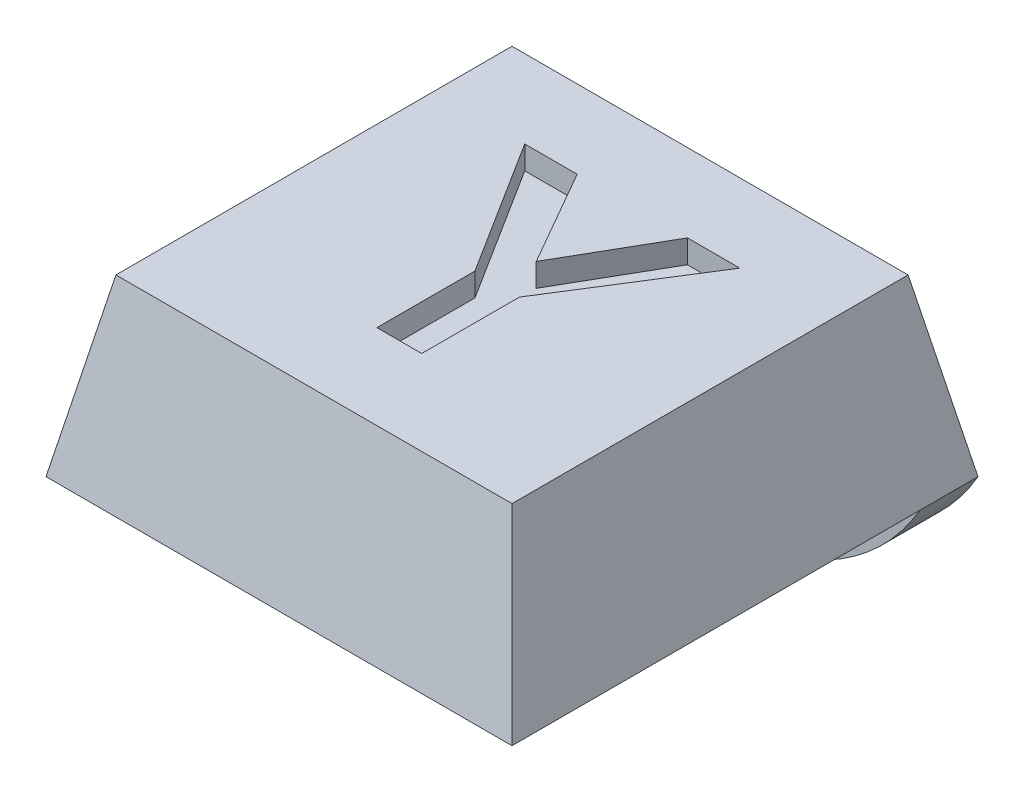
ISO-10303-21;
HEADER;
FILE_DESCRIPTION(('STEP AP214'),'2;1');
FILE_NAME('part.step','',(''),(''),'','','');
FILE_SCHEMA(('AUTOMOTIVE_DESIGN { 1 0 10303 214 1 1 1 1 }'));
ENDSEC;
DATA;
#1=APPLICATION_CONTEXT('core data for automotive mechanical design processes');
#2=APPLICATION_PROTOCOL_DEFINITION('international standard','automotive_design',2000,#1);
#3=PRODUCT_CONTEXT('',#1,'mechanical');
#4=PRODUCT('Part','Part','',(#3));
#5=PRODUCT_RELATED_PRODUCT_CATEGORY('part','',(#4));
#6=PRODUCT_DEFINITION_FORMATION('','',#4);
#7=PRODUCT_DEFINITION_CONTEXT('part definition',#1,'design');
#8=PRODUCT_DEFINITION('design','',#6,#7);
#9=PRODUCT_DEFINITION_SHAPE('','',#8);
#10=(LENGTH_UNIT() NAMED_UNIT(*) SI_UNIT(.MILLI.,.METRE.));
#11=(NAMED_UNIT(*) PLANE_ANGLE_UNIT() SI_UNIT($,.RADIAN.));
#12=(NAMED_UNIT(*) SI_UNIT($,.STERADIAN.) SOLID_ANGLE_UNIT());
#13=UNCERTAINTY_MEASURE_WITH_UNIT(LENGTH_MEASURE(1.E-05),#10,'distance_accuracy_value','');
#14=(GEOMETRIC_REPRESENTATION_CONTEXT(3) GLOBAL_UNCERTAINTY_ASSIGNED_CONTEXT((#13)) GLOBAL_UNIT_ASSIGNED_CONTEXT((#10,
#11,#12)) REPRESENTATION_CONTEXT('',''));
#15=CARTESIAN_POINT('',(0.,0.,0.));
#16=DIRECTION('',(0.,0.,1.));
#17=DIRECTION('',(1.,0.,0.));
#18=AXIS2_PLACEMENT_3D('',#15,#16,#17);
#19=CARTESIAN_POINT('',(0.,3.,0.));
#20=DIRECTION('',(0.,-1.,0.));
#21=DIRECTION('',(0.,0.,-1.));
#22=AXIS2_PLACEMENT_3D('',#19,#20,#21);
#23=PLANE('',#22);
#24=DIRECTION('',(-1.,0.,0.));
#25=VECTOR('',#24,1.);
#26=CARTESIAN_POINT('',(11.,3.,-0.6));
#27=LINE('',#26,#25);
#28=CARTESIAN_POINT('',(7.4,3.,-0.6));
#29=VERTEX_POINT('',#28);
#30=CARTESIAN_POINT('',(0.6,3.,-0.6));
#31=VERTEX_POINT('',#30);
#32=EDGE_CURVE('E211',#29,#31,#27,.T.);
#33=ORIENTED_EDGE('',*,*,#32,.F.);
#34=DIRECTION('',(0.,0.,1.));
#35=VECTOR('',#34,1.);
#36=CARTESIAN_POINT('',(7.4,3.,-8.));
#37=LINE('',#36,#35);
#38=CARTESIAN_POINT('',(7.4,3.,-7.4));
#39=VERTEX_POINT('',#38);
#40=EDGE_CURVE('E224',#39,#29,#37,.T.);
#41=ORIENTED_EDGE('',*,*,#40,.F.);
#42=DIRECTION('',(-1.,0.,0.));
#43=VECTOR('',#42,1.);
#44=CARTESIAN_POINT('',(11.,3.,-7.4));
#45=LINE('',#44,#43);
#46=CARTESIAN_POINT('',(0.599999999999999,3.,-7.4));
#47=VERTEX_POINT('',#46);
#48=EDGE_CURVE('E207',#39,#47,#45,.T.);
#49=ORIENTED_EDGE('',*,*,#48,.T.);
#50=DIRECTION('',(0.,0.,1.));
#51=VECTOR('',#50,1.);
#52=CARTESIAN_POINT('',(0.6,3.,-8.));
#53=LINE('',#52,#51);
#54=EDGE_CURVE('E227',#47,#31,#53,.T.);
#55=ORIENTED_EDGE('',*,*,#54,.T.);
#56=EDGE_LOOP('',(#33,#41,#49,#55));
#57=FACE_BOUND('',#56,.T.);
#58=DIRECTION('',(-1.,0.,0.));
#59=VECTOR('',#58,1.);
#60=CARTESIAN_POINT('',(4.39307301252336,3.,-2.05683246367483));
#61=LINE('',#60,#59);
#62=CARTESIAN_POINT('',(4.39307301252336,3.,-2.05683246367483));
#63=VERTEX_POINT('',#62);
#64=CARTESIAN_POINT('',(3.62384224329259,3.,-2.05683246367483));
#65=VERTEX_POINT('',#64);
#66=EDGE_CURVE('E58',#63,#65,#61,.T.);
#67=ORIENTED_EDGE('',*,*,#66,.T.);
#68=DIRECTION('',(0.,0.,-1.));
#69=VECTOR('',#68,1.);
#70=CARTESIAN_POINT('',(3.62384224329259,3.,-2.05683246367483));
#71=LINE('',#70,#69);
#72=CARTESIAN_POINT('',(3.62384224329259,3.,-3.74032605341842));
#73=VERTEX_POINT('',#72);
#74=EDGE_CURVE('E179',#65,#73,#71,.T.);
#75=ORIENTED_EDGE('',*,*,#74,.T.);
#76=DIRECTION('',(-0.533596697576265,0.,-0.845739063976416));
#77=VECTOR('',#76,1.);
#78=CARTESIAN_POINT('',(3.62384224329259,3.,-3.74032605341842));
#79=LINE('',#78,#77);
#80=CARTESIAN_POINT('',(2.16230378175413,3.,-6.05683246367483));
#81=VERTEX_POINT('',#80);
#82=EDGE_CURVE('E603',#73,#81,#79,.T.);
#83=ORIENTED_EDGE('',*,*,#82,.T.);
#84=DIRECTION('',(1.,0.,0.));
#85=VECTOR('',#84,1.);
#86=CARTESIAN_POINT('',(2.16230378175413,3.,-6.05683246367483));
#87=LINE('',#86,#85);
#88=CARTESIAN_POINT('',(3.06214352534388,3.,-6.05683246367483));
#89=VERTEX_POINT('',#88);
#90=EDGE_CURVE('E605',#81,#89,#87,.T.);
#91=ORIENTED_EDGE('',*,*,#90,.T.);
#92=DIRECTION('',(0.497591443991854,0.,0.867411525670545));
#93=VECTOR('',#92,1.);
#94=CARTESIAN_POINT('',(3.06214352534388,3.,-6.05683246367483));
#95=LINE('',#94,#93);
#96=CARTESIAN_POINT('',(4.0076563458567,3.,-4.40859528418765));
#97=VERTEX_POINT('',#96);
#98=EDGE_CURVE('E610',#89,#97,#95,.T.);
#99=ORIENTED_EDGE('',*,*,#98,.T.);
#100=DIRECTION('',(0.498225602522097,0.,-0.867047431800299));
#101=VECTOR('',#100,1.);
#102=CARTESIAN_POINT('',(4.0076563458567,3.,-4.40859528418765));
#103=LINE('',#102,#101);
#104=CARTESIAN_POINT('',(4.95477173047208,3.,-6.05683246367483));
#105=VERTEX_POINT('',#104);
#106=EDGE_CURVE('E578',#97,#105,#103,.T.);
#107=ORIENTED_EDGE('',*,*,#106,.T.);
#108=DIRECTION('',(1.,0.,0.));
#109=VECTOR('',#108,1.);
#110=CARTESIAN_POINT('',(4.95477173047208,3.,-6.05683246367483));
#111=LINE('',#110,#109);
#112=CARTESIAN_POINT('',(5.85461147406183,3.,-6.05683246367483));
#113=VERTEX_POINT('',#112);
#114=EDGE_CURVE('E573',#105,#113,#111,.T.);
#115=ORIENTED_EDGE('',*,*,#114,.T.);
#116=DIRECTION('',(-0.532673842471013,0.,0.846320611557563));
#117=VECTOR('',#116,1.);
#118=CARTESIAN_POINT('',(5.85461147406183,3.,-6.05683246367483));
#119=LINE('',#118,#117);
#120=CARTESIAN_POINT('',(4.39307301252336,3.,-3.73471707905944));
#121=VERTEX_POINT('',#120);
#122=EDGE_CURVE('E567',#113,#121,#119,.T.);
#123=ORIENTED_EDGE('',*,*,#122,.T.);
#124=DIRECTION('',(0.,0.,1.));
#125=VECTOR('',#124,1.);
#126=CARTESIAN_POINT('',(4.39307301252336,3.,-3.73471707905944));
#127=LINE('',#126,#125);
#128=EDGE_CURVE('E175',#121,#63,#127,.T.);
#129=ORIENTED_EDGE('',*,*,#128,.T.);
#130=EDGE_LOOP('',(#67,#75,#83,#91,#99,#107,#115,#123,#129));
#131=FACE_BOUND('',#130,.T.);
#132=ADVANCED_FACE('F42',(#57,#131),#23,.F.);
#133=CARTESIAN_POINT('',(8.,0.,-8.));
#134=DIRECTION('',(-0.98058067569092,-0.196116135138184,0.));
#135=DIRECTION('',(0.196116135138184,-0.98058067569092,0.));
#136=AXIS2_PLACEMENT_3D('',#133,#134,#135);
#137=PLANE('',#136);
#138=DIRECTION('',(-0.192450089729875,0.962250448649376,-0.192450089729875));
#139=VECTOR('',#138,1.);
#140=CARTESIAN_POINT('',(7.7037037037037,1.48148148148148,-0.296296296296296));
#141=LINE('',#140,#139);
#142=CARTESIAN_POINT('',(8.,0.,0.));
#143=VERTEX_POINT('',#142);
#144=EDGE_CURVE('E221',#143,#29,#141,.T.);
#145=ORIENTED_EDGE('',*,*,#144,.F.);
#146=DIRECTION('',(0.,0.,-1.));
#147=VECTOR('',#146,1.);
#148=CARTESIAN_POINT('',(8.,0.,0.));
#149=LINE('',#148,#147);
#150=CARTESIAN_POINT('',(8.,0.,-7.));
#151=VERTEX_POINT('',#150);
#152=EDGE_CURVE('E240',#143,#151,#149,.T.);
#153=ORIENTED_EDGE('',*,*,#152,.T.);
#154=DIRECTION('',(0.,0.,1.));
#155=VECTOR('',#154,1.);
#156=CARTESIAN_POINT('',(8.,0.,-8.));
#157=LINE('',#156,#155);
#158=CARTESIAN_POINT('',(8.,0.,-8.));
#159=VERTEX_POINT('',#158);
#160=EDGE_CURVE('E181',#159,#151,#157,.T.);
#161=ORIENTED_EDGE('',*,*,#160,.F.);
#162=DIRECTION('',(0.192450089729875,-0.962250448649376,-0.192450089729875));
#163=VECTOR('',#162,1.);
#164=CARTESIAN_POINT('',(8.,0.,-8.));
#165=LINE('',#164,#163);
#166=EDGE_CURVE('E214',#39,#159,#165,.T.);
#167=ORIENTED_EDGE('',*,*,#166,.F.);
#168=ORIENTED_EDGE('',*,*,#40,.T.);
#169=EDGE_LOOP('',(#145,#153,#161,#167,#168));
#170=FACE_BOUND('',#169,.T.);
#171=ADVANCED_FACE('F308',(#170),#137,.F.);
#172=CARTESIAN_POINT('',(0.,0.,-8.));
#173=DIRECTION('',(0.98058067569092,-0.196116135138184,0.));
#174=DIRECTION('',(0.196116135138184,0.98058067569092,0.));
#175=AXIS2_PLACEMENT_3D('',#172,#173,#174);
#176=PLANE('',#175);
#177=DIRECTION('',(-0.192450089729875,-0.962250448649376,0.192450089729875));
#178=VECTOR('',#177,1.);
#179=CARTESIAN_POINT('',(0.296296296296296,1.48148148148148,-0.296296296296296));
#180=LINE('',#179,#178);
#181=CARTESIAN_POINT('',(0.,0.,0.));
#182=VERTEX_POINT('',#181);
#183=EDGE_CURVE('E268',#31,#182,#180,.T.);
#184=ORIENTED_EDGE('',*,*,#183,.F.);
#185=ORIENTED_EDGE('',*,*,#54,.F.);
#186=DIRECTION('',(0.192450089729875,0.962250448649376,0.192450089729875));
#187=VECTOR('',#186,1.);
#188=CARTESIAN_POINT('',(0.,0.,-8.));
#189=LINE('',#188,#187);
#190=CARTESIAN_POINT('',(0.,0.,-8.));
#191=VERTEX_POINT('',#190);
#192=EDGE_CURVE('E239',#191,#47,#189,.T.);
#193=ORIENTED_EDGE('',*,*,#192,.F.);
#194=DIRECTION('',(0.,0.,1.));
#195=VECTOR('',#194,1.);
#196=CARTESIAN_POINT('',(0.,0.,0.));
#197=LINE('',#196,#195);
#198=CARTESIAN_POINT('',(0.,0.,-7.));
#199=VERTEX_POINT('',#198);
#200=EDGE_CURVE('E244',#191,#199,#197,.T.);
#201=ORIENTED_EDGE('',*,*,#200,.T.);
#202=EDGE_CURVE('E231',#199,#182,#197,.T.);
#203=ORIENTED_EDGE('',*,*,#202,.T.);
#204=EDGE_LOOP('',(#184,#185,#193,#201,#203));
#205=FACE_BOUND('',#204,.T.);
#206=ADVANCED_FACE('F292',(#205),#176,.F.);
#207=CARTESIAN_POINT('',(0.,0.,0.));
#208=DIRECTION('',(0.,-1.,0.));
#209=DIRECTION('',(0.,0.,-1.));
#210=AXIS2_PLACEMENT_3D('',#207,#208,#209);
#211=PLANE('',#210);
#212=DIRECTION('',(-1.,0.,0.));
#213=VECTOR('',#212,1.);
#214=CARTESIAN_POINT('',(0.,0.,-7.));
#215=LINE('',#214,#213);
#216=EDGE_CURVE('E187',#151,#199,#215,.T.);
#217=ORIENTED_EDGE('',*,*,#216,.F.);
#218=ORIENTED_EDGE('',*,*,#152,.F.);
#219=DIRECTION('',(1.,0.,0.));
#220=VECTOR('',#219,1.);
#221=CARTESIAN_POINT('',(0.,0.,0.));
#222=LINE('',#221,#220);
#223=EDGE_CURVE('E241',#182,#143,#222,.T.);
#224=ORIENTED_EDGE('',*,*,#223,.F.);
#225=ORIENTED_EDGE('',*,*,#202,.F.);
#226=EDGE_LOOP('',(#217,#218,#224,#225));
#227=FACE_BOUND('',#226,.T.);
#228=CARTESIAN_POINT('',(4.,0.,-3.75));
#229=DIRECTION('',(0.,-1.,0.));
#230=DIRECTION('',(0.,0.,-1.));
#231=AXIS2_PLACEMENT_3D('',#228,#229,#230);
#232=CIRCLE('',#231,1.8);
#233=CARTESIAN_POINT('',(4.,0.,-5.55));
#234=VERTEX_POINT('',#233);
#235=EDGE_CURVE('E199',#234,#234,#232,.T.);
#236=ORIENTED_EDGE('',*,*,#235,.F.);
#237=EDGE_LOOP('',(#236));
#238=FACE_BOUND('',#237,.T.);
#239=ADVANCED_FACE('F303',(#227,#238),#211,.T.);
#240=CARTESIAN_POINT('',(11.,3.,-7.4));
#241=DIRECTION('',(0.,0.196116135138184,-0.98058067569092));
#242=DIRECTION('',(0.,0.98058067569092,0.196116135138184));
#243=AXIS2_PLACEMENT_3D('',#240,#241,#242);
#244=PLANE('',#243);
#245=ORIENTED_EDGE('',*,*,#166,.T.);
#246=DIRECTION('',(-1.,0.,0.));
#247=VECTOR('',#246,1.);
#248=CARTESIAN_POINT('',(0.,0.,-8.));
#249=LINE('',#248,#247);
#250=EDGE_CURVE('E235',#159,#191,#249,.T.);
#251=ORIENTED_EDGE('',*,*,#250,.T.);
#252=ORIENTED_EDGE('',*,*,#192,.T.);
#253=ORIENTED_EDGE('',*,*,#48,.F.);
#254=EDGE_LOOP('',(#245,#251,#252,#253));
#255=FACE_BOUND('',#254,.T.);
#256=ADVANCED_FACE('F287',(#255),#244,.T.);
#257=CARTESIAN_POINT('',(11.,0.,0.));
#258=DIRECTION('',(0.,0.196116135138184,0.98058067569092));
#259=DIRECTION('',(0.,-0.98058067569092,0.196116135138184));
#260=AXIS2_PLACEMENT_3D('',#257,#258,#259);
#261=PLANE('',#260);
#262=ORIENTED_EDGE('',*,*,#144,.T.);
#263=ORIENTED_EDGE('',*,*,#32,.T.);
#264=ORIENTED_EDGE('',*,*,#183,.T.);
#265=ORIENTED_EDGE('',*,*,#223,.T.);
#266=EDGE_LOOP('',(#262,#263,#264,#265));
#267=FACE_BOUND('',#266,.T.);
#268=ADVANCED_FACE('F334',(#267),#261,.T.);
#269=CARTESIAN_POINT('',(4.,0.8,-3.75));
#270=DIRECTION('',(0.,-1.,0.));
#271=DIRECTION('',(0.,0.,-1.));
#272=AXIS2_PLACEMENT_3D('',#269,#270,#271);
#273=CYLINDRICAL_SURFACE('',#272,1.8);
#274=CARTESIAN_POINT('',(4.,0.8,-3.75));
#275=DIRECTION('',(0.,-1.,0.));
#276=DIRECTION('',(0.,0.,-1.));
#277=AXIS2_PLACEMENT_3D('',#274,#275,#276);
#278=CIRCLE('',#277,1.8);
#279=CARTESIAN_POINT('',(4.,0.8,-5.55));
#280=VERTEX_POINT('',#279);
#281=EDGE_CURVE('E203',#280,#280,#278,.T.);
#282=ORIENTED_EDGE('',*,*,#281,.F.);
#283=EDGE_LOOP('',(#282));
#284=FACE_BOUND('',#283,.T.);
#285=ORIENTED_EDGE('',*,*,#235,.T.);
#286=EDGE_LOOP('',(#285));
#287=FACE_BOUND('',#286,.T.);
#288=ADVANCED_FACE('F341',(#284,#287),#273,.F.);
#289=CARTESIAN_POINT('',(4.,0.8,-3.75));
#290=DIRECTION('',(0.,-1.,0.));
#291=DIRECTION('',(0.,0.,-1.));
#292=AXIS2_PLACEMENT_3D('',#289,#290,#291);
#293=PLANE('',#292);
#294=ORIENTED_EDGE('',*,*,#281,.T.);
#295=EDGE_LOOP('',(#294));
#296=FACE_BOUND('',#295,.T.);
#297=ADVANCED_FACE('F345',(#296),#293,.T.);
#298=CARTESIAN_POINT('',(0.,-2.,-8.));
#299=DIRECTION('',(0.,0.,1.));
#300=DIRECTION('',(1.,0.,0.));
#301=AXIS2_PLACEMENT_3D('',#298,#299,#300);
#302=PLANE('',#301);
#303=ORIENTED_EDGE('',*,*,#250,.F.);
#304=CARTESIAN_POINT('',(4.53589838486225,2.,-8.));
#305=DIRECTION('',(0.,0.,1.));
#306=DIRECTION('',(1.,0.,0.));
#307=AXIS2_PLACEMENT_3D('',#304,#305,#306);
#308=CIRCLE('',#307,4.);
#309=CARTESIAN_POINT('',(4.53589838486225,-2.,-8.));
#310=VERTEX_POINT('',#309);
#311=EDGE_CURVE('E11',#159,#310,#308,.F.);
#312=ORIENTED_EDGE('',*,*,#311,.T.);
#313=DIRECTION('',(1.,0.,0.));
#314=VECTOR('',#313,1.);
#315=CARTESIAN_POINT('',(0.,-2.,-8.));
#316=LINE('',#315,#314);
#317=CARTESIAN_POINT('',(3.46410161513775,-2.,-8.));
#318=VERTEX_POINT('',#317);
#319=EDGE_CURVE('E193',#318,#310,#316,.T.);
#320=ORIENTED_EDGE('',*,*,#319,.F.);
#321=CARTESIAN_POINT('',(3.46410161513775,2.,-8.));
#322=DIRECTION('',(0.,0.,1.));
#323=DIRECTION('',(1.,0.,0.));
#324=AXIS2_PLACEMENT_3D('',#321,#322,#323);
#325=CIRCLE('',#324,4.);
#326=EDGE_CURVE('E51',#318,#191,#325,.F.);
#327=ORIENTED_EDGE('',*,*,#326,.T.);
#328=EDGE_LOOP('',(#303,#312,#320,#327));
#329=FACE_BOUND('',#328,.T.);
#330=ADVANCED_FACE('F280',(#329),#302,.F.);
#331=CARTESIAN_POINT('',(0.,-2.,-7.));
#332=DIRECTION('',(0.,0.,-1.));
#333=DIRECTION('',(-1.,0.,0.));
#334=AXIS2_PLACEMENT_3D('',#331,#332,#333);
#335=PLANE('',#334);
#336=DIRECTION('',(-1.,0.,0.));
#337=VECTOR('',#336,1.);
#338=CARTESIAN_POINT('',(0.,-2.,-7.));
#339=LINE('',#338,#337);
#340=CARTESIAN_POINT('',(4.53589838486225,-2.,-7.));
#341=VERTEX_POINT('',#340);
#342=CARTESIAN_POINT('',(3.46410161513775,-2.,-7.));
#343=VERTEX_POINT('',#342);
#344=EDGE_CURVE('E197',#341,#343,#339,.T.);
#345=ORIENTED_EDGE('',*,*,#344,.F.);
#346=CARTESIAN_POINT('',(4.53589838486225,2.,-7.));
#347=DIRECTION('',(0.,0.,-1.));
#348=DIRECTION('',(-1.,0.,0.));
#349=AXIS2_PLACEMENT_3D('',#346,#347,#348);
#350=CIRCLE('',#349,4.);
#351=EDGE_CURVE('E274',#341,#151,#350,.F.);
#352=ORIENTED_EDGE('',*,*,#351,.T.);
#353=ORIENTED_EDGE('',*,*,#216,.T.);
#354=CARTESIAN_POINT('',(3.46410161513775,2.,-7.));
#355=DIRECTION('',(0.,0.,-1.));
#356=DIRECTION('',(-1.,0.,0.));
#357=AXIS2_PLACEMENT_3D('',#354,#355,#356);
#358=CIRCLE('',#357,4.);
#359=EDGE_CURVE('E66',#199,#343,#358,.F.);
#360=ORIENTED_EDGE('',*,*,#359,.T.);
#361=EDGE_LOOP('',(#345,#352,#353,#360));
#362=FACE_BOUND('',#361,.T.);
#363=ADVANCED_FACE('F298',(#362),#335,.F.);
#364=CARTESIAN_POINT('',(0.,-2.,0.));
#365=DIRECTION('',(0.,1.,0.));
#366=DIRECTION('',(0.,0.,1.));
#367=AXIS2_PLACEMENT_3D('',#364,#365,#366);
#368=PLANE('',#367);
#369=ORIENTED_EDGE('',*,*,#319,.T.);
#370=DIRECTION('',(0.,0.,1.));
#371=VECTOR('',#370,1.);
#372=CARTESIAN_POINT('',(4.53589838486225,-2.,0.));
#373=LINE('',#372,#371);
#374=EDGE_CURVE('E267',#310,#341,#373,.T.);
#375=ORIENTED_EDGE('',*,*,#374,.T.);
#376=ORIENTED_EDGE('',*,*,#344,.T.);
#377=DIRECTION('',(0.,0.,-1.));
#378=VECTOR('',#377,1.);
#379=CARTESIAN_POINT('',(3.46410161513775,-2.,0.));
#380=LINE('',#379,#378);
#381=EDGE_CURVE('E263',#343,#318,#380,.T.);
#382=ORIENTED_EDGE('',*,*,#381,.T.);
#383=EDGE_LOOP('',(#369,#375,#376,#382));
#384=FACE_BOUND('',#383,.T.);
#385=ADVANCED_FACE('F296',(#384),#368,.F.);
#386=CARTESIAN_POINT('',(4.53589838486225,2.,-8.));
#387=DIRECTION('',(0.,0.,1.));
#388=DIRECTION('',(1.,0.,0.));
#389=AXIS2_PLACEMENT_3D('',#386,#387,#388);
#390=CYLINDRICAL_SURFACE('',#389,4.);
#391=ORIENTED_EDGE('',*,*,#311,.F.);
#392=ORIENTED_EDGE('',*,*,#160,.T.);
#393=ORIENTED_EDGE('',*,*,#351,.F.);
#394=ORIENTED_EDGE('',*,*,#374,.F.);
#395=EDGE_LOOP('',(#391,#392,#393,#394));
#396=FACE_BOUND('',#395,.T.);
#397=ADVANCED_FACE('F309',(#396),#390,.T.);
#398=CARTESIAN_POINT('',(3.46410161513775,2.,-8.));
#399=DIRECTION('',(0.,0.,-1.));
#400=DIRECTION('',(-1.,0.,0.));
#401=AXIS2_PLACEMENT_3D('',#398,#399,#400);
#402=CYLINDRICAL_SURFACE('',#401,4.);
#403=ORIENTED_EDGE('',*,*,#359,.F.);
#404=ORIENTED_EDGE('',*,*,#200,.F.);
#405=ORIENTED_EDGE('',*,*,#326,.F.);
#406=ORIENTED_EDGE('',*,*,#381,.F.);
#407=EDGE_LOOP('',(#403,#404,#405,#406));
#408=FACE_BOUND('',#407,.T.);
#409=ADVANCED_FACE('F44',(#408),#402,.T.);
#410=CARTESIAN_POINT('',(4.39307301252336,2.6,-2.05683246367483));
#411=DIRECTION('',(0.,0.,-1.));
#412=DIRECTION('',(-1.,0.,0.));
#413=AXIS2_PLACEMENT_3D('',#410,#411,#412);
#414=PLANE('',#413);
#415=ORIENTED_EDGE('',*,*,#66,.F.);
#416=DIRECTION('',(0.,1.,0.));
#417=VECTOR('',#416,1.);
#418=CARTESIAN_POINT('',(4.39307301252336,2.6,-2.05683246367483));
#419=LINE('',#418,#417);
#420=CARTESIAN_POINT('',(4.39307301252336,2.6,-2.05683246367483));
#421=VERTEX_POINT('',#420);
#422=EDGE_CURVE('E173',#421,#63,#419,.T.);
#423=ORIENTED_EDGE('',*,*,#422,.F.);
#424=DIRECTION('',(-1.,0.,0.));
#425=VECTOR('',#424,1.);
#426=CARTESIAN_POINT('',(4.39307301252336,2.6,-2.05683246367483));
#427=LINE('',#426,#425);
#428=CARTESIAN_POINT('',(3.62384224329259,2.6,-2.05683246367483));
#429=VERTEX_POINT('',#428);
#430=EDGE_CURVE('E163',#421,#429,#427,.T.);
#431=ORIENTED_EDGE('',*,*,#430,.T.);
#432=DIRECTION('',(0.,1.,0.));
#433=VECTOR('',#432,1.);
#434=CARTESIAN_POINT('',(3.62384224329259,2.6,-2.05683246367483));
#435=LINE('',#434,#433);
#436=EDGE_CURVE('E172',#429,#65,#435,.T.);
#437=ORIENTED_EDGE('',*,*,#436,.T.);
#438=EDGE_LOOP('',(#415,#423,#431,#437));
#439=FACE_BOUND('',#438,.T.);
#440=ADVANCED_FACE('F171',(#439),#414,.T.);
#441=CARTESIAN_POINT('',(3.62384224329259,2.6,-2.05683246367483));
#442=DIRECTION('',(1.,0.,0.));
#443=DIRECTION('',(0.,0.,-1.));
#444=AXIS2_PLACEMENT_3D('',#441,#442,#443);
#445=PLANE('',#444);
#446=ORIENTED_EDGE('',*,*,#74,.F.);
#447=ORIENTED_EDGE('',*,*,#436,.F.);
#448=DIRECTION('',(0.,0.,-1.));
#449=VECTOR('',#448,1.);
#450=CARTESIAN_POINT('',(3.62384224329259,2.6,-2.05683246367483));
#451=LINE('',#450,#449);
#452=CARTESIAN_POINT('',(3.62384224329259,2.6,-3.74032605341842));
#453=VERTEX_POINT('',#452);
#454=EDGE_CURVE('E159',#429,#453,#451,.T.);
#455=ORIENTED_EDGE('',*,*,#454,.T.);
#456=DIRECTION('',(0.,1.,0.));
#457=VECTOR('',#456,1.);
#458=CARTESIAN_POINT('',(3.62384224329259,2.6,-3.74032605341842));
#459=LINE('',#458,#457);
#460=EDGE_CURVE('E182',#453,#73,#459,.T.);
#461=ORIENTED_EDGE('',*,*,#460,.T.);
#462=EDGE_LOOP('',(#446,#447,#455,#461));
#463=FACE_BOUND('',#462,.T.);
#464=ADVANCED_FACE('F177',(#463),#445,.T.);
#465=CARTESIAN_POINT('',(3.62384224329259,2.6,-3.74032605341842));
#466=DIRECTION('',(0.845739063976416,0.,-0.533596697576265));
#467=DIRECTION('',(-0.533596697576265,0.,-0.845739063976416));
#468=AXIS2_PLACEMENT_3D('',#465,#466,#467);
#469=PLANE('',#468);
#470=ORIENTED_EDGE('',*,*,#82,.F.);
#471=ORIENTED_EDGE('',*,*,#460,.F.);
#472=DIRECTION('',(-0.533596697576265,0.,-0.845739063976416));
#473=VECTOR('',#472,1.);
#474=CARTESIAN_POINT('',(3.62384224329259,2.6,-3.74032605341842));
#475=LINE('',#474,#473);
#476=CARTESIAN_POINT('',(2.16230378175413,2.6,-6.05683246367483));
#477=VERTEX_POINT('',#476);
#478=EDGE_CURVE('E165',#453,#477,#475,.T.);
#479=ORIENTED_EDGE('',*,*,#478,.T.);
#480=DIRECTION('',(0.,1.,0.));
#481=VECTOR('',#480,1.);
#482=CARTESIAN_POINT('',(2.16230378175413,2.6,-6.05683246367483));
#483=LINE('',#482,#481);
#484=EDGE_CURVE('E189',#477,#81,#483,.T.);
#485=ORIENTED_EDGE('',*,*,#484,.T.);
#486=EDGE_LOOP('',(#470,#471,#479,#485));
#487=FACE_BOUND('',#486,.T.);
#488=ADVANCED_FACE('F358',(#487),#469,.T.);
#489=CARTESIAN_POINT('',(2.16230378175413,2.6,-6.05683246367483));
#490=DIRECTION('',(0.,0.,1.));
#491=DIRECTION('',(1.,0.,0.));
#492=AXIS2_PLACEMENT_3D('',#489,#490,#491);
#493=PLANE('',#492);
#494=ORIENTED_EDGE('',*,*,#90,.F.);
#495=ORIENTED_EDGE('',*,*,#484,.F.);
#496=DIRECTION('',(1.,0.,0.));
#497=VECTOR('',#496,1.);
#498=CARTESIAN_POINT('',(2.16230378175413,2.6,-6.05683246367483));
#499=LINE('',#498,#497);
#500=CARTESIAN_POINT('',(3.06214352534388,2.6,-6.05683246367483));
#501=VERTEX_POINT('',#500);
#502=EDGE_CURVE('E642',#477,#501,#499,.T.);
#503=ORIENTED_EDGE('',*,*,#502,.T.);
#504=DIRECTION('',(0.,1.,0.));
#505=VECTOR('',#504,1.);
#506=CARTESIAN_POINT('',(3.06214352534388,2.6,-6.05683246367483));
#507=LINE('',#506,#505);
#508=EDGE_CURVE('E596',#501,#89,#507,.T.);
#509=ORIENTED_EDGE('',*,*,#508,.T.);
#510=EDGE_LOOP('',(#494,#495,#503,#509));
#511=FACE_BOUND('',#510,.T.);
#512=ADVANCED_FACE('F361',(#511),#493,.T.);
#513=CARTESIAN_POINT('',(3.06214352534388,2.6,-6.05683246367483));
#514=DIRECTION('',(-0.867411525670545,0.,0.497591443991854));
#515=DIRECTION('',(0.497591443991854,0.,0.867411525670545));
#516=AXIS2_PLACEMENT_3D('',#513,#514,#515);
#517=PLANE('',#516);
#518=ORIENTED_EDGE('',*,*,#98,.F.);
#519=ORIENTED_EDGE('',*,*,#508,.F.);
#520=DIRECTION('',(0.497591443991854,0.,0.867411525670545));
#521=VECTOR('',#520,1.);
#522=CARTESIAN_POINT('',(3.06214352534388,2.6,-6.05683246367483));
#523=LINE('',#522,#521);
#524=CARTESIAN_POINT('',(4.0076563458567,2.6,-4.40859528418765));
#525=VERTEX_POINT('',#524);
#526=EDGE_CURVE('E639',#501,#525,#523,.T.);
#527=ORIENTED_EDGE('',*,*,#526,.T.);
#528=DIRECTION('',(0.,1.,0.));
#529=VECTOR('',#528,1.);
#530=CARTESIAN_POINT('',(4.0076563458567,2.6,-4.40859528418765));
#531=LINE('',#530,#529);
#532=EDGE_CURVE('E593',#525,#97,#531,.T.);
#533=ORIENTED_EDGE('',*,*,#532,.T.);
#534=EDGE_LOOP('',(#518,#519,#527,#533));
#535=FACE_BOUND('',#534,.T.);
#536=ADVANCED_FACE('F365',(#535),#517,.T.);
#537=CARTESIAN_POINT('',(4.0076563458567,2.6,-4.40859528418765));
#538=DIRECTION('',(0.867047431800299,0.,0.498225602522097));
#539=DIRECTION('',(0.498225602522097,0.,-0.867047431800299));
#540=AXIS2_PLACEMENT_3D('',#537,#538,#539);
#541=PLANE('',#540);
#542=ORIENTED_EDGE('',*,*,#106,.F.);
#543=ORIENTED_EDGE('',*,*,#532,.F.);
#544=DIRECTION('',(0.498225602522097,0.,-0.867047431800299));
#545=VECTOR('',#544,1.);
#546=CARTESIAN_POINT('',(4.0076563458567,2.6,-4.40859528418765));
#547=LINE('',#546,#545);
#548=CARTESIAN_POINT('',(4.95477173047208,2.6,-6.05683246367483));
#549=VERTEX_POINT('',#548);
#550=EDGE_CURVE('E624',#525,#549,#547,.T.);
#551=ORIENTED_EDGE('',*,*,#550,.T.);
#552=DIRECTION('',(0.,1.,0.));
#553=VECTOR('',#552,1.);
#554=CARTESIAN_POINT('',(4.95477173047208,2.6,-6.05683246367483));
#555=LINE('',#554,#553);
#556=EDGE_CURVE('E590',#549,#105,#555,.T.);
#557=ORIENTED_EDGE('',*,*,#556,.T.);
#558=EDGE_LOOP('',(#542,#543,#551,#557));
#559=FACE_BOUND('',#558,.T.);
#560=ADVANCED_FACE('F369',(#559),#541,.T.);
#561=CARTESIAN_POINT('',(4.95477173047208,2.6,-6.05683246367483));
#562=DIRECTION('',(0.,0.,1.));
#563=DIRECTION('',(1.,0.,0.));
#564=AXIS2_PLACEMENT_3D('',#561,#562,#563);
#565=PLANE('',#564);
#566=ORIENTED_EDGE('',*,*,#114,.F.);
#567=ORIENTED_EDGE('',*,*,#556,.F.);
#568=DIRECTION('',(1.,0.,0.));
#569=VECTOR('',#568,1.);
#570=CARTESIAN_POINT('',(4.95477173047208,2.6,-6.05683246367483));
#571=LINE('',#570,#569);
#572=CARTESIAN_POINT('',(5.85461147406183,2.6,-6.05683246367483));
#573=VERTEX_POINT('',#572);
#574=EDGE_CURVE('E626',#549,#573,#571,.T.);
#575=ORIENTED_EDGE('',*,*,#574,.T.);
#576=DIRECTION('',(0.,1.,0.));
#577=VECTOR('',#576,1.);
#578=CARTESIAN_POINT('',(5.85461147406183,2.6,-6.05683246367483));
#579=LINE('',#578,#577);
#580=EDGE_CURVE('E587',#573,#113,#579,.T.);
#581=ORIENTED_EDGE('',*,*,#580,.T.);
#582=EDGE_LOOP('',(#566,#567,#575,#581));
#583=FACE_BOUND('',#582,.T.);
#584=ADVANCED_FACE('F373',(#583),#565,.T.);
#585=CARTESIAN_POINT('',(5.85461147406183,2.6,-6.05683246367483));
#586=DIRECTION('',(-0.846320611557563,0.,-0.532673842471013));
#587=DIRECTION('',(-0.532673842471013,0.,0.846320611557563));
#588=AXIS2_PLACEMENT_3D('',#585,#586,#587);
#589=PLANE('',#588);
#590=ORIENTED_EDGE('',*,*,#122,.F.);
#591=ORIENTED_EDGE('',*,*,#580,.F.);
#592=DIRECTION('',(-0.532673842471013,0.,0.846320611557563));
#593=VECTOR('',#592,1.);
#594=CARTESIAN_POINT('',(5.85461147406183,2.6,-6.05683246367483));
#595=LINE('',#594,#593);
#596=CARTESIAN_POINT('',(4.39307301252336,2.6,-3.73471707905944));
#597=VERTEX_POINT('',#596);
#598=EDGE_CURVE('E628',#573,#597,#595,.T.);
#599=ORIENTED_EDGE('',*,*,#598,.T.);
#600=DIRECTION('',(0.,1.,0.));
#601=VECTOR('',#600,1.);
#602=CARTESIAN_POINT('',(4.39307301252336,2.6,-3.73471707905944));
#603=LINE('',#602,#601);
#604=EDGE_CURVE('E565',#597,#121,#603,.T.);
#605=ORIENTED_EDGE('',*,*,#604,.T.);
#606=EDGE_LOOP('',(#590,#591,#599,#605));
#607=FACE_BOUND('',#606,.T.);
#608=ADVANCED_FACE('F377',(#607),#589,.T.);
#609=CARTESIAN_POINT('',(4.39307301252336,2.6,-3.73471707905944));
#610=DIRECTION('',(-1.,0.,0.));
#611=DIRECTION('',(0.,0.,1.));
#612=AXIS2_PLACEMENT_3D('',#609,#610,#611);
#613=PLANE('',#612);
#614=ORIENTED_EDGE('',*,*,#128,.F.);
#615=ORIENTED_EDGE('',*,*,#604,.F.);
#616=DIRECTION('',(0.,0.,1.));
#617=VECTOR('',#616,1.);
#618=CARTESIAN_POINT('',(4.39307301252336,2.6,-3.73471707905944));
#619=LINE('',#618,#617);
#620=EDGE_CURVE('E584',#597,#421,#619,.T.);
#621=ORIENTED_EDGE('',*,*,#620,.T.);
#622=ORIENTED_EDGE('',*,*,#422,.T.);
#623=EDGE_LOOP('',(#614,#615,#621,#622));
#624=FACE_BOUND('',#623,.T.);
#625=ADVANCED_FACE('F381',(#624),#613,.T.);
#626=CARTESIAN_POINT('',(0.,2.6,0.));
#627=DIRECTION('',(0.,-1.,0.));
#628=DIRECTION('',(0.,0.,-1.));
#629=AXIS2_PLACEMENT_3D('',#626,#627,#628);
#630=PLANE('',#629);
#631=ORIENTED_EDGE('',*,*,#430,.F.);
#632=ORIENTED_EDGE('',*,*,#620,.F.);
#633=ORIENTED_EDGE('',*,*,#598,.F.);
#634=ORIENTED_EDGE('',*,*,#574,.F.);
#635=ORIENTED_EDGE('',*,*,#550,.F.);
#636=ORIENTED_EDGE('',*,*,#526,.F.);
#637=ORIENTED_EDGE('',*,*,#502,.F.);
#638=ORIENTED_EDGE('',*,*,#478,.F.);
#639=ORIENTED_EDGE('',*,*,#454,.F.);
#640=EDGE_LOOP('',(#631,#632,#633,#634,#635,#636,#637,#638,#639));
#641=FACE_BOUND('',#640,.T.);
#642=ADVANCED_FACE('F161',(#641),#630,.F.);
#643=CLOSED_SHELL('',(#132,#171,#206,#239,#256,#268,#288,#297,#330,#363,#385,#397,#409,#440,
#464,#488,#512,#536,#560,#584,#608,#625,#642));
#644=MANIFOLD_SOLID_BREP('B2',#643);
#645=ADVANCED_BREP_SHAPE_REPRESENTATION('',(#18,#644),#14);
#646=SHAPE_DEFINITION_REPRESENTATION(#9,#645);
ENDSEC;
END-ISO-10303-21;
